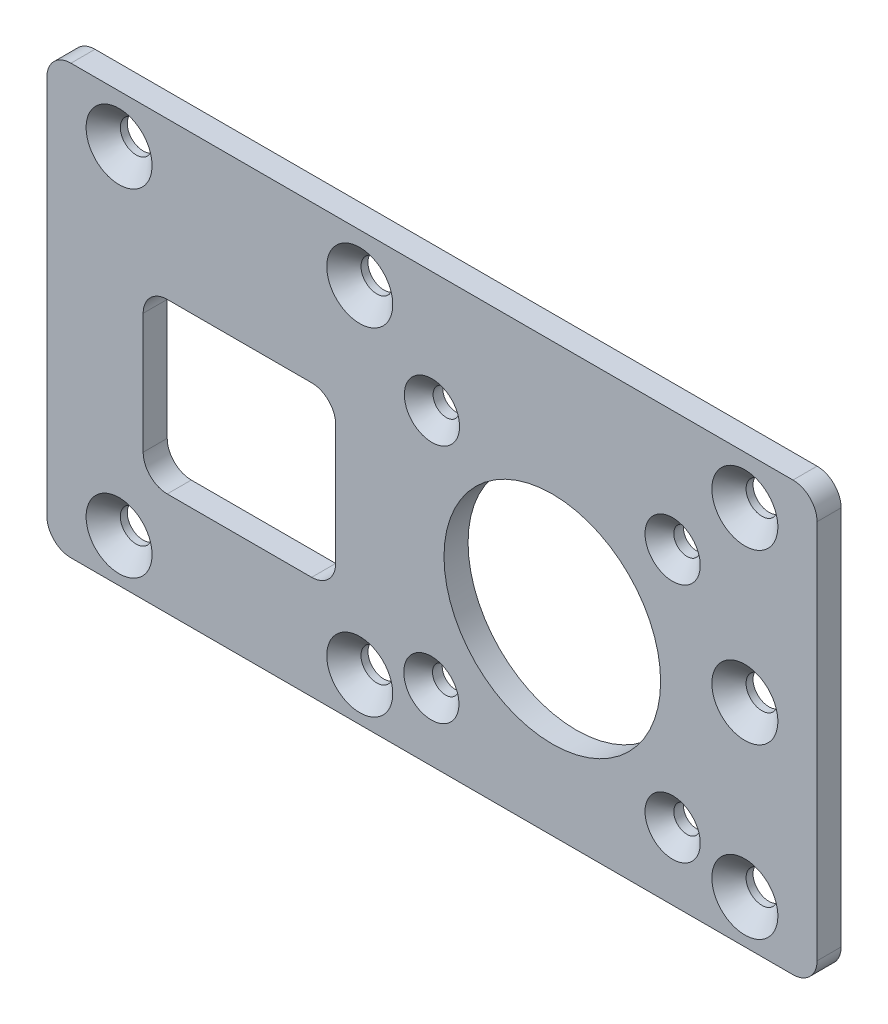
ISO-10303-21;
HEADER;
FILE_DESCRIPTION(('STEP AP214'),'2;1');
FILE_NAME('part.step','',(''),(''),'','','');
FILE_SCHEMA(('AUTOMOTIVE_DESIGN { 1 0 10303 214 1 1 1 1 }'));
ENDSEC;
DATA;
#1=APPLICATION_CONTEXT('core data for automotive mechanical design processes');
#2=APPLICATION_PROTOCOL_DEFINITION('international standard','automotive_design',2000,#1);
#3=PRODUCT_CONTEXT('',#1,'mechanical');
#4=PRODUCT('Part','Part','',(#3));
#5=PRODUCT_RELATED_PRODUCT_CATEGORY('part','',(#4));
#6=PRODUCT_DEFINITION_FORMATION('','',#4);
#7=PRODUCT_DEFINITION_CONTEXT('part definition',#1,'design');
#8=PRODUCT_DEFINITION('design','',#6,#7);
#9=PRODUCT_DEFINITION_SHAPE('','',#8);
#10=(LENGTH_UNIT() NAMED_UNIT(*) SI_UNIT(.MILLI.,.METRE.));
#11=(NAMED_UNIT(*) PLANE_ANGLE_UNIT() SI_UNIT($,.RADIAN.));
#12=(NAMED_UNIT(*) SI_UNIT($,.STERADIAN.) SOLID_ANGLE_UNIT());
#13=UNCERTAINTY_MEASURE_WITH_UNIT(LENGTH_MEASURE(1.E-05),#10,'distance_accuracy_value','');
#14=(GEOMETRIC_REPRESENTATION_CONTEXT(3) GLOBAL_UNCERTAINTY_ASSIGNED_CONTEXT((#13)) GLOBAL_UNIT_ASSIGNED_CONTEXT((#10,
#11,#12)) REPRESENTATION_CONTEXT('',''));
#15=CARTESIAN_POINT('',(0.,0.,0.));
#16=DIRECTION('',(0.,0.,1.));
#17=DIRECTION('',(1.,0.,0.));
#18=AXIS2_PLACEMENT_3D('',#15,#16,#17);
#19=CARTESIAN_POINT('',(55.,-39.,-5.));
#20=DIRECTION('',(-1.,0.,0.));
#21=DIRECTION('',(0.,-1.,0.));
#22=AXIS2_PLACEMENT_3D('',#19,#20,#21);
#23=PLANE('',#22);
#24=DIRECTION('',(0.,1.,0.));
#25=VECTOR('',#24,1.);
#26=CARTESIAN_POINT('',(55.,-39.,-5.));
#27=LINE('',#26,#25);
#28=CARTESIAN_POINT('',(55.,-34.,-5.));
#29=VERTEX_POINT('',#28);
#30=CARTESIAN_POINT('',(55.,45.,-5.));
#31=VERTEX_POINT('',#30);
#32=EDGE_CURVE('E392',#29,#31,#27,.T.);
#33=ORIENTED_EDGE('',*,*,#32,.T.);
#34=DIRECTION('',(0.,0.,1.));
#35=VECTOR('',#34,1.);
#36=CARTESIAN_POINT('',(55.,45.,-5.));
#37=LINE('',#36,#35);
#38=CARTESIAN_POINT('',(55.,45.,0.));
#39=VERTEX_POINT('',#38);
#40=EDGE_CURVE('E208',#39,#31,#37,.F.);
#41=ORIENTED_EDGE('',*,*,#40,.F.);
#42=DIRECTION('',(0.,1.,0.));
#43=VECTOR('',#42,1.);
#44=CARTESIAN_POINT('',(55.,-39.,0.));
#45=LINE('',#44,#43);
#46=CARTESIAN_POINT('',(55.,-34.,0.));
#47=VERTEX_POINT('',#46);
#48=EDGE_CURVE('E409',#47,#39,#45,.T.);
#49=ORIENTED_EDGE('',*,*,#48,.F.);
#50=DIRECTION('',(0.,0.,1.));
#51=VECTOR('',#50,1.);
#52=CARTESIAN_POINT('',(55.,-34.,-5.));
#53=LINE('',#52,#51);
#54=EDGE_CURVE('E199',#29,#47,#53,.T.);
#55=ORIENTED_EDGE('',*,*,#54,.F.);
#56=EDGE_LOOP('',(#33,#41,#49,#55));
#57=FACE_BOUND('',#56,.T.);
#58=ADVANCED_FACE('F53',(#57),#23,.F.);
#59=CARTESIAN_POINT('',(-105.,50.0000000000005,-5.));
#60=DIRECTION('',(0.,-1.,0.));
#61=DIRECTION('',(1.,0.,0.));
#62=AXIS2_PLACEMENT_3D('',#59,#60,#61);
#63=PLANE('',#62);
#64=DIRECTION('',(-1.,0.,0.));
#65=VECTOR('',#64,1.);
#66=CARTESIAN_POINT('',(-105.,50.0000000000005,0.));
#67=LINE('',#66,#65);
#68=CARTESIAN_POINT('',(50.,50.,0.));
#69=VERTEX_POINT('',#68);
#70=CARTESIAN_POINT('',(-100.,50.0000000000005,0.));
#71=VERTEX_POINT('',#70);
#72=EDGE_CURVE('E413',#69,#71,#67,.T.);
#73=ORIENTED_EDGE('',*,*,#72,.F.);
#74=DIRECTION('',(0.,0.,1.));
#75=VECTOR('',#74,1.);
#76=CARTESIAN_POINT('',(50.,50.,-5.));
#77=LINE('',#76,#75);
#78=CARTESIAN_POINT('',(50.,50.,-5.));
#79=VERTEX_POINT('',#78);
#80=EDGE_CURVE('E481',#79,#69,#77,.T.);
#81=ORIENTED_EDGE('',*,*,#80,.F.);
#82=DIRECTION('',(-1.,0.,0.));
#83=VECTOR('',#82,1.);
#84=CARTESIAN_POINT('',(-105.,50.0000000000005,-5.));
#85=LINE('',#84,#83);
#86=CARTESIAN_POINT('',(-100.,50.0000000000005,-5.));
#87=VERTEX_POINT('',#86);
#88=EDGE_CURVE('E396',#79,#87,#85,.T.);
#89=ORIENTED_EDGE('',*,*,#88,.T.);
#90=DIRECTION('',(0.,0.,1.));
#91=VECTOR('',#90,1.);
#92=CARTESIAN_POINT('',(-100.,50.0000000000005,-5.));
#93=LINE('',#92,#91);
#94=EDGE_CURVE('E483',#71,#87,#93,.F.);
#95=ORIENTED_EDGE('',*,*,#94,.F.);
#96=EDGE_LOOP('',(#73,#81,#89,#95));
#97=FACE_BOUND('',#96,.T.);
#98=ADVANCED_FACE('F497',(#97),#63,.F.);
#99=CARTESIAN_POINT('',(-105.,-39.,-5.));
#100=DIRECTION('',(1.,0.,0.));
#101=DIRECTION('',(0.,0.,1.));
#102=AXIS2_PLACEMENT_3D('',#99,#100,#101);
#103=PLANE('',#102);
#104=DIRECTION('',(0.,-1.,0.));
#105=VECTOR('',#104,1.);
#106=CARTESIAN_POINT('',(-105.,-39.,0.));
#107=LINE('',#106,#105);
#108=CARTESIAN_POINT('',(-105.,45.0000000000005,0.));
#109=VERTEX_POINT('',#108);
#110=CARTESIAN_POINT('',(-105.,-34.,0.));
#111=VERTEX_POINT('',#110);
#112=EDGE_CURVE('E417',#109,#111,#107,.T.);
#113=ORIENTED_EDGE('',*,*,#112,.F.);
#114=DIRECTION('',(0.,0.,1.));
#115=VECTOR('',#114,1.);
#116=CARTESIAN_POINT('',(-105.,45.0000000000005,-5.));
#117=LINE('',#116,#115);
#118=CARTESIAN_POINT('',(-105.,45.0000000000005,-5.));
#119=VERTEX_POINT('',#118);
#120=EDGE_CURVE('E463',#119,#109,#117,.T.);
#121=ORIENTED_EDGE('',*,*,#120,.F.);
#122=DIRECTION('',(0.,-1.,0.));
#123=VECTOR('',#122,1.);
#124=CARTESIAN_POINT('',(-105.,-39.,-5.));
#125=LINE('',#124,#123);
#126=CARTESIAN_POINT('',(-105.,-34.,-5.));
#127=VERTEX_POINT('',#126);
#128=EDGE_CURVE('E401',#119,#127,#125,.T.);
#129=ORIENTED_EDGE('',*,*,#128,.T.);
#130=DIRECTION('',(0.,0.,1.));
#131=VECTOR('',#130,1.);
#132=CARTESIAN_POINT('',(-105.,-34.,-5.));
#133=LINE('',#132,#131);
#134=EDGE_CURVE('E467',#111,#127,#133,.F.);
#135=ORIENTED_EDGE('',*,*,#134,.F.);
#136=EDGE_LOOP('',(#113,#121,#129,#135));
#137=FACE_BOUND('',#136,.T.);
#138=ADVANCED_FACE('F512',(#137),#103,.F.);
#139=CARTESIAN_POINT('',(-105.,-39.,-5.));
#140=DIRECTION('',(0.,1.,0.));
#141=DIRECTION('',(0.,0.,-1.));
#142=AXIS2_PLACEMENT_3D('',#139,#140,#141);
#143=PLANE('',#142);
#144=DIRECTION('',(1.,0.,0.));
#145=VECTOR('',#144,1.);
#146=CARTESIAN_POINT('',(-105.,-39.,-5.));
#147=LINE('',#146,#145);
#148=CARTESIAN_POINT('',(-100.,-39.,-5.));
#149=VERTEX_POINT('',#148);
#150=CARTESIAN_POINT('',(50.,-39.,-5.));
#151=VERTEX_POINT('',#150);
#152=EDGE_CURVE('E405',#149,#151,#147,.T.);
#153=ORIENTED_EDGE('',*,*,#152,.T.);
#154=DIRECTION('',(0.,0.,1.));
#155=VECTOR('',#154,1.);
#156=CARTESIAN_POINT('',(50.,-39.,-5.));
#157=LINE('',#156,#155);
#158=CARTESIAN_POINT('',(50.,-39.,0.));
#159=VERTEX_POINT('',#158);
#160=EDGE_CURVE('E444',#159,#151,#157,.F.);
#161=ORIENTED_EDGE('',*,*,#160,.F.);
#162=DIRECTION('',(1.,0.,0.));
#163=VECTOR('',#162,1.);
#164=CARTESIAN_POINT('',(-105.,-39.,0.));
#165=LINE('',#164,#163);
#166=CARTESIAN_POINT('',(-100.,-39.,0.));
#167=VERTEX_POINT('',#166);
#168=EDGE_CURVE('E397',#167,#159,#165,.T.);
#169=ORIENTED_EDGE('',*,*,#168,.F.);
#170=DIRECTION('',(0.,0.,1.));
#171=VECTOR('',#170,1.);
#172=CARTESIAN_POINT('',(-100.,-39.,-5.));
#173=LINE('',#172,#171);
#174=EDGE_CURVE('E448',#149,#167,#173,.T.);
#175=ORIENTED_EDGE('',*,*,#174,.F.);
#176=EDGE_LOOP('',(#153,#161,#169,#175));
#177=FACE_BOUND('',#176,.T.);
#178=ADVANCED_FACE('F505',(#177),#143,.F.);
#179=CARTESIAN_POINT('',(0.,0.,-5.));
#180=DIRECTION('',(0.,0.,1.));
#181=DIRECTION('',(-1.,0.,0.));
#182=AXIS2_PLACEMENT_3D('',#179,#180,#181);
#183=PLANE('',#182);
#184=DIRECTION('',(0.,1.,0.));
#185=VECTOR('',#184,1.);
#186=CARTESIAN_POINT('',(-85.,0.,-5.));
#187=LINE('',#186,#185);
#188=CARTESIAN_POINT('',(-85.,-12.5,-5.));
#189=VERTEX_POINT('',#188);
#190=CARTESIAN_POINT('',(-85.,12.5,-5.));
#191=VERTEX_POINT('',#190);
#192=EDGE_CURVE('E246',#189,#191,#187,.T.);
#193=ORIENTED_EDGE('',*,*,#192,.F.);
#194=CARTESIAN_POINT('',(-80.,-12.5,-5.));
#195=DIRECTION('',(0.,0.,-1.));
#196=DIRECTION('',(-1.,0.,0.));
#197=AXIS2_PLACEMENT_3D('',#194,#195,#196);
#198=CIRCLE('',#197,5.);
#199=CARTESIAN_POINT('',(-80.,-17.5,-5.));
#200=VERTEX_POINT('',#199);
#201=EDGE_CURVE('E175',#200,#189,#198,.T.);
#202=ORIENTED_EDGE('',*,*,#201,.F.);
#203=DIRECTION('',(-1.,0.,0.));
#204=VECTOR('',#203,1.);
#205=CARTESIAN_POINT('',(0.,-17.5,-5.));
#206=LINE('',#205,#204);
#207=CARTESIAN_POINT('',(-50.,-17.5,-5.));
#208=VERTEX_POINT('',#207);
#209=EDGE_CURVE('E240',#208,#200,#206,.T.);
#210=ORIENTED_EDGE('',*,*,#209,.F.);
#211=CARTESIAN_POINT('',(-50.,-12.5,-5.));
#212=DIRECTION('',(0.,0.,-1.));
#213=DIRECTION('',(-1.,0.,0.));
#214=AXIS2_PLACEMENT_3D('',#211,#212,#213);
#215=CIRCLE('',#214,5.);
#216=CARTESIAN_POINT('',(-45.,-12.5,-5.));
#217=VERTEX_POINT('',#216);
#218=EDGE_CURVE('E222',#217,#208,#215,.T.);
#219=ORIENTED_EDGE('',*,*,#218,.F.);
#220=DIRECTION('',(0.,-1.,0.));
#221=VECTOR('',#220,1.);
#222=CARTESIAN_POINT('',(-45.,0.,-5.));
#223=LINE('',#222,#221);
#224=CARTESIAN_POINT('',(-45.,12.5,-5.));
#225=VERTEX_POINT('',#224);
#226=EDGE_CURVE('E255',#225,#217,#223,.T.);
#227=ORIENTED_EDGE('',*,*,#226,.F.);
#228=CARTESIAN_POINT('',(-50.,12.5,-5.));
#229=DIRECTION('',(0.,0.,-1.));
#230=DIRECTION('',(-1.,0.,0.));
#231=AXIS2_PLACEMENT_3D('',#228,#229,#230);
#232=CIRCLE('',#231,5.);
#233=CARTESIAN_POINT('',(-50.,17.5,-5.));
#234=VERTEX_POINT('',#233);
#235=EDGE_CURVE('E11',#234,#225,#232,.T.);
#236=ORIENTED_EDGE('',*,*,#235,.F.);
#237=DIRECTION('',(1.,0.,0.));
#238=VECTOR('',#237,1.);
#239=CARTESIAN_POINT('',(0.,17.5,-5.));
#240=LINE('',#239,#238);
#241=CARTESIAN_POINT('',(-80.,17.5,-5.));
#242=VERTEX_POINT('',#241);
#243=EDGE_CURVE('E252',#242,#234,#240,.T.);
#244=ORIENTED_EDGE('',*,*,#243,.F.);
#245=CARTESIAN_POINT('',(-80.,12.5,-5.));
#246=DIRECTION('',(0.,0.,-1.));
#247=DIRECTION('',(-1.,0.,0.));
#248=AXIS2_PLACEMENT_3D('',#245,#246,#247);
#249=CIRCLE('',#248,5.);
#250=EDGE_CURVE('E214',#191,#242,#249,.T.);
#251=ORIENTED_EDGE('',*,*,#250,.F.);
#252=EDGE_LOOP('',(#193,#202,#210,#219,#227,#236,#244,#251));
#253=FACE_BOUND('',#252,.T.);
#254=CARTESIAN_POINT('',(25.,25.,-5.));
#255=DIRECTION('',(0.,0.,-1.));
#256=DIRECTION('',(-1.,0.,0.));
#257=AXIS2_PLACEMENT_3D('',#254,#255,#256);
#258=CIRCLE('',#257,2.75);
#259=CARTESIAN_POINT('',(22.25,25.,-5.));
#260=VERTEX_POINT('',#259);
#261=EDGE_CURVE('E267',#260,#260,#258,.T.);
#262=ORIENTED_EDGE('',*,*,#261,.F.);
#263=EDGE_LOOP('',(#262));
#264=FACE_BOUND('',#263,.T.);
#265=CARTESIAN_POINT('',(25.,-25.,-5.));
#266=DIRECTION('',(0.,0.,-1.));
#267=DIRECTION('',(-1.,0.,0.));
#268=AXIS2_PLACEMENT_3D('',#265,#266,#267);
#269=CIRCLE('',#268,2.75);
#270=CARTESIAN_POINT('',(22.25,-25.,-5.));
#271=VERTEX_POINT('',#270);
#272=EDGE_CURVE('E278',#271,#271,#269,.T.);
#273=ORIENTED_EDGE('',*,*,#272,.F.);
#274=EDGE_LOOP('',(#273));
#275=FACE_BOUND('',#274,.T.);
#276=CARTESIAN_POINT('',(-25.1249454463221,-25.,-5.));
#277=DIRECTION('',(0.,0.,-1.));
#278=DIRECTION('',(-1.,0.,0.));
#279=AXIS2_PLACEMENT_3D('',#276,#277,#278);
#280=CIRCLE('',#279,2.75);
#281=CARTESIAN_POINT('',(-27.8749454463221,-25.,-5.));
#282=VERTEX_POINT('',#281);
#283=EDGE_CURVE('E290',#282,#282,#280,.T.);
#284=ORIENTED_EDGE('',*,*,#283,.F.);
#285=EDGE_LOOP('',(#284));
#286=FACE_BOUND('',#285,.T.);
#287=CARTESIAN_POINT('',(-25.,25.,-5.));
#288=DIRECTION('',(0.,0.,-1.));
#289=DIRECTION('',(-1.,0.,0.));
#290=AXIS2_PLACEMENT_3D('',#287,#288,#289);
#291=CIRCLE('',#290,2.75);
#292=CARTESIAN_POINT('',(-27.75,25.,-5.));
#293=VERTEX_POINT('',#292);
#294=EDGE_CURVE('E302',#293,#293,#291,.T.);
#295=ORIENTED_EDGE('',*,*,#294,.F.);
#296=EDGE_LOOP('',(#295));
#297=FACE_BOUND('',#296,.T.);
#298=CARTESIAN_POINT('',(40.,-30.,-5.));
#299=DIRECTION('',(0.,0.,-1.));
#300=DIRECTION('',(-1.,0.,0.));
#301=AXIS2_PLACEMENT_3D('',#298,#299,#300);
#302=CIRCLE('',#301,3.3);
#303=CARTESIAN_POINT('',(36.7,-30.,-5.));
#304=VERTEX_POINT('',#303);
#305=EDGE_CURVE('E314',#304,#304,#302,.T.);
#306=ORIENTED_EDGE('',*,*,#305,.F.);
#307=EDGE_LOOP('',(#306));
#308=FACE_BOUND('',#307,.T.);
#309=CARTESIAN_POINT('',(40.,4.99999999999999,-5.));
#310=DIRECTION('',(0.,0.,-1.));
#311=DIRECTION('',(-1.,0.,0.));
#312=AXIS2_PLACEMENT_3D('',#309,#310,#311);
#313=CIRCLE('',#312,3.3);
#314=CARTESIAN_POINT('',(36.7,4.99999999999999,-5.));
#315=VERTEX_POINT('',#314);
#316=EDGE_CURVE('E325',#315,#315,#313,.T.);
#317=ORIENTED_EDGE('',*,*,#316,.F.);
#318=EDGE_LOOP('',(#317));
#319=FACE_BOUND('',#318,.T.);
#320=CARTESIAN_POINT('',(40.,40.,-5.));
#321=DIRECTION('',(0.,0.,-1.));
#322=DIRECTION('',(-1.,0.,0.));
#323=AXIS2_PLACEMENT_3D('',#320,#321,#322);
#324=CIRCLE('',#323,3.3);
#325=CARTESIAN_POINT('',(36.7,40.,-5.));
#326=VERTEX_POINT('',#325);
#327=EDGE_CURVE('E337',#326,#326,#324,.T.);
#328=ORIENTED_EDGE('',*,*,#327,.F.);
#329=EDGE_LOOP('',(#328));
#330=FACE_BOUND('',#329,.T.);
#331=CARTESIAN_POINT('',(-40.,40.,-5.));
#332=DIRECTION('',(0.,0.,-1.));
#333=DIRECTION('',(-1.,0.,0.));
#334=AXIS2_PLACEMENT_3D('',#331,#332,#333);
#335=CIRCLE('',#334,3.3);
#336=CARTESIAN_POINT('',(-43.3,40.,-5.));
#337=VERTEX_POINT('',#336);
#338=EDGE_CURVE('E349',#337,#337,#335,.T.);
#339=ORIENTED_EDGE('',*,*,#338,.F.);
#340=EDGE_LOOP('',(#339));
#341=FACE_BOUND('',#340,.T.);
#342=CARTESIAN_POINT('',(-40.,-30.,-5.));
#343=DIRECTION('',(0.,0.,-1.));
#344=DIRECTION('',(-1.,0.,0.));
#345=AXIS2_PLACEMENT_3D('',#342,#343,#344);
#346=CIRCLE('',#345,3.3);
#347=CARTESIAN_POINT('',(-43.3,-30.,-5.));
#348=VERTEX_POINT('',#347);
#349=EDGE_CURVE('E361',#348,#348,#346,.T.);
#350=ORIENTED_EDGE('',*,*,#349,.F.);
#351=EDGE_LOOP('',(#350));
#352=FACE_BOUND('',#351,.T.);
#353=CARTESIAN_POINT('',(-90.,-30.,-5.));
#354=DIRECTION('',(0.,0.,-1.));
#355=DIRECTION('',(-1.,0.,0.));
#356=AXIS2_PLACEMENT_3D('',#353,#354,#355);
#357=CIRCLE('',#356,3.3);
#358=CARTESIAN_POINT('',(-93.3,-30.,-5.));
#359=VERTEX_POINT('',#358);
#360=EDGE_CURVE('E373',#359,#359,#357,.T.);
#361=ORIENTED_EDGE('',*,*,#360,.F.);
#362=EDGE_LOOP('',(#361));
#363=FACE_BOUND('',#362,.T.);
#364=CARTESIAN_POINT('',(-90.,40.,-5.));
#365=DIRECTION('',(0.,0.,-1.));
#366=DIRECTION('',(-1.,0.,0.));
#367=AXIS2_PLACEMENT_3D('',#364,#365,#366);
#368=CIRCLE('',#367,3.3);
#369=CARTESIAN_POINT('',(-93.3,40.,-5.));
#370=VERTEX_POINT('',#369);
#371=EDGE_CURVE('E383',#370,#370,#368,.T.);
#372=ORIENTED_EDGE('',*,*,#371,.F.);
#373=EDGE_LOOP('',(#372));
#374=FACE_BOUND('',#373,.T.);
#375=CARTESIAN_POINT('',(0.,0.,-5.));
#376=DIRECTION('',(0.,0.,1.));
#377=DIRECTION('',(1.,0.,0.));
#378=AXIS2_PLACEMENT_3D('',#375,#376,#377);
#379=CIRCLE('',#378,22.5);
#380=CARTESIAN_POINT('',(22.5,0.,-5.));
#381=VERTEX_POINT('',#380);
#382=EDGE_CURVE('E387',#381,#381,#379,.T.);
#383=ORIENTED_EDGE('',*,*,#382,.T.);
#384=EDGE_LOOP('',(#383));
#385=FACE_BOUND('',#384,.T.);
#386=ORIENTED_EDGE('',*,*,#128,.F.);
#387=CARTESIAN_POINT('',(-100.,45.0000000000005,-5.));
#388=DIRECTION('',(0.,0.,-1.));
#389=DIRECTION('',(-1.,0.,0.));
#390=AXIS2_PLACEMENT_3D('',#387,#388,#389);
#391=CIRCLE('',#390,5.);
#392=EDGE_CURVE('E69',#87,#119,#391,.F.);
#393=ORIENTED_EDGE('',*,*,#392,.F.);
#394=ORIENTED_EDGE('',*,*,#88,.F.);
#395=CARTESIAN_POINT('',(50.,45.,-5.));
#396=DIRECTION('',(0.,0.,-1.));
#397=DIRECTION('',(-1.,0.,0.));
#398=AXIS2_PLACEMENT_3D('',#395,#396,#397);
#399=CIRCLE('',#398,5.);
#400=EDGE_CURVE('E77',#31,#79,#399,.F.);
#401=ORIENTED_EDGE('',*,*,#400,.F.);
#402=ORIENTED_EDGE('',*,*,#32,.F.);
#403=CARTESIAN_POINT('',(50.,-34.,-5.));
#404=DIRECTION('',(0.,0.,-1.));
#405=DIRECTION('',(-1.,0.,0.));
#406=AXIS2_PLACEMENT_3D('',#403,#404,#405);
#407=CIRCLE('',#406,5.);
#408=EDGE_CURVE('E473',#151,#29,#407,.F.);
#409=ORIENTED_EDGE('',*,*,#408,.F.);
#410=ORIENTED_EDGE('',*,*,#152,.F.);
#411=CARTESIAN_POINT('',(-100.,-34.,-5.));
#412=DIRECTION('',(0.,0.,-1.));
#413=DIRECTION('',(-1.,0.,0.));
#414=AXIS2_PLACEMENT_3D('',#411,#412,#413);
#415=CIRCLE('',#414,5.);
#416=EDGE_CURVE('E478',#127,#149,#415,.F.);
#417=ORIENTED_EDGE('',*,*,#416,.F.);
#418=EDGE_LOOP('',(#386,#393,#394,#401,#402,#409,#410,#417));
#419=FACE_BOUND('',#418,.T.);
#420=ADVANCED_FACE('F491',(#253,#264,#275,#286,#297,#308,#319,#330,#341,#352,#363,#374,#385,
#419),#183,.F.);
#421=CARTESIAN_POINT('',(0.,0.,0.));
#422=DIRECTION('',(0.,0.,1.));
#423=DIRECTION('',(-1.,0.,0.));
#424=AXIS2_PLACEMENT_3D('',#421,#422,#423);
#425=PLANE('',#424);
#426=DIRECTION('',(0.,-1.,0.));
#427=VECTOR('',#426,1.);
#428=CARTESIAN_POINT('',(-45.,-17.5,0.));
#429=LINE('',#428,#427);
#430=CARTESIAN_POINT('',(-45.,12.5,0.));
#431=VERTEX_POINT('',#430);
#432=CARTESIAN_POINT('',(-45.,-12.5,0.));
#433=VERTEX_POINT('',#432);
#434=EDGE_CURVE('E1107',#431,#433,#429,.T.);
#435=ORIENTED_EDGE('',*,*,#434,.T.);
#436=CARTESIAN_POINT('',(-50.,-12.5,0.));
#437=DIRECTION('',(0.,0.,-1.));
#438=DIRECTION('',(-1.,0.,0.));
#439=AXIS2_PLACEMENT_3D('',#436,#437,#438);
#440=CIRCLE('',#439,5.);
#441=CARTESIAN_POINT('',(-50.,-17.5,0.));
#442=VERTEX_POINT('',#441);
#443=EDGE_CURVE('E218',#442,#433,#440,.F.);
#444=ORIENTED_EDGE('',*,*,#443,.F.);
#445=DIRECTION('',(-1.,0.,0.));
#446=VECTOR('',#445,1.);
#447=CARTESIAN_POINT('',(-85.,-17.5,0.));
#448=LINE('',#447,#446);
#449=CARTESIAN_POINT('',(-80.,-17.5,0.));
#450=VERTEX_POINT('',#449);
#451=EDGE_CURVE('E191',#442,#450,#448,.T.);
#452=ORIENTED_EDGE('',*,*,#451,.T.);
#453=CARTESIAN_POINT('',(-80.,-12.5,0.));
#454=DIRECTION('',(0.,0.,-1.));
#455=DIRECTION('',(-1.,0.,0.));
#456=AXIS2_PLACEMENT_3D('',#453,#454,#455);
#457=CIRCLE('',#456,5.);
#458=CARTESIAN_POINT('',(-85.,-12.5,0.));
#459=VERTEX_POINT('',#458);
#460=EDGE_CURVE('E172',#459,#450,#457,.F.);
#461=ORIENTED_EDGE('',*,*,#460,.F.);
#462=DIRECTION('',(0.,1.,0.));
#463=VECTOR('',#462,1.);
#464=CARTESIAN_POINT('',(-85.,-17.5,0.));
#465=LINE('',#464,#463);
#466=CARTESIAN_POINT('',(-85.,12.5,0.));
#467=VERTEX_POINT('',#466);
#468=EDGE_CURVE('E184',#459,#467,#465,.T.);
#469=ORIENTED_EDGE('',*,*,#468,.T.);
#470=CARTESIAN_POINT('',(-80.,12.5,0.));
#471=DIRECTION('',(0.,0.,-1.));
#472=DIRECTION('',(-1.,0.,0.));
#473=AXIS2_PLACEMENT_3D('',#470,#471,#472);
#474=CIRCLE('',#473,5.);
#475=CARTESIAN_POINT('',(-80.,17.5,0.));
#476=VERTEX_POINT('',#475);
#477=EDGE_CURVE('E204',#476,#467,#474,.F.);
#478=ORIENTED_EDGE('',*,*,#477,.F.);
#479=DIRECTION('',(1.,0.,0.));
#480=VECTOR('',#479,1.);
#481=CARTESIAN_POINT('',(-85.,17.5,0.));
#482=LINE('',#481,#480);
#483=CARTESIAN_POINT('',(-50.,17.5,0.));
#484=VERTEX_POINT('',#483);
#485=EDGE_CURVE('E190',#476,#484,#482,.T.);
#486=ORIENTED_EDGE('',*,*,#485,.T.);
#487=CARTESIAN_POINT('',(-50.,12.5,0.));
#488=DIRECTION('',(0.,0.,-1.));
#489=DIRECTION('',(-1.,0.,0.));
#490=AXIS2_PLACEMENT_3D('',#487,#488,#489);
#491=CIRCLE('',#490,5.);
#492=EDGE_CURVE('E62',#431,#484,#491,.F.);
#493=ORIENTED_EDGE('',*,*,#492,.F.);
#494=EDGE_LOOP('',(#435,#444,#452,#461,#469,#478,#486,#493));
#495=FACE_BOUND('',#494,.T.);
#496=CARTESIAN_POINT('',(25.,25.,0.));
#497=DIRECTION('',(0.,0.,-1.));
#498=DIRECTION('',(-1.,0.,0.));
#499=AXIS2_PLACEMENT_3D('',#496,#497,#498);
#500=CIRCLE('',#499,5.735);
#501=CARTESIAN_POINT('',(19.265,25.,0.));
#502=VERTEX_POINT('',#501);
#503=EDGE_CURVE('E259',#502,#502,#500,.T.);
#504=ORIENTED_EDGE('',*,*,#503,.T.);
#505=EDGE_LOOP('',(#504));
#506=FACE_BOUND('',#505,.T.);
#507=CARTESIAN_POINT('',(25.,-25.,0.));
#508=DIRECTION('',(0.,0.,-1.));
#509=DIRECTION('',(-1.,0.,0.));
#510=AXIS2_PLACEMENT_3D('',#507,#508,#509);
#511=CIRCLE('',#510,5.735);
#512=CARTESIAN_POINT('',(19.265,-25.,0.));
#513=VERTEX_POINT('',#512);
#514=EDGE_CURVE('E271',#513,#513,#511,.T.);
#515=ORIENTED_EDGE('',*,*,#514,.T.);
#516=EDGE_LOOP('',(#515));
#517=FACE_BOUND('',#516,.T.);
#518=CARTESIAN_POINT('',(-25.1249454463221,-25.,0.));
#519=DIRECTION('',(0.,0.,-1.));
#520=DIRECTION('',(-1.,0.,0.));
#521=AXIS2_PLACEMENT_3D('',#518,#519,#520);
#522=CIRCLE('',#521,5.735);
#523=CARTESIAN_POINT('',(-30.8599454463221,-25.,0.));
#524=VERTEX_POINT('',#523);
#525=EDGE_CURVE('E282',#524,#524,#522,.T.);
#526=ORIENTED_EDGE('',*,*,#525,.T.);
#527=EDGE_LOOP('',(#526));
#528=FACE_BOUND('',#527,.T.);
#529=CARTESIAN_POINT('',(-25.,25.,0.));
#530=DIRECTION('',(0.,0.,-1.));
#531=DIRECTION('',(-1.,0.,0.));
#532=AXIS2_PLACEMENT_3D('',#529,#530,#531);
#533=CIRCLE('',#532,5.735);
#534=CARTESIAN_POINT('',(-30.735,25.,0.));
#535=VERTEX_POINT('',#534);
#536=EDGE_CURVE('E294',#535,#535,#533,.T.);
#537=ORIENTED_EDGE('',*,*,#536,.T.);
#538=EDGE_LOOP('',(#537));
#539=FACE_BOUND('',#538,.T.);
#540=CARTESIAN_POINT('',(40.,-30.,0.));
#541=DIRECTION('',(0.,0.,-1.));
#542=DIRECTION('',(-1.,0.,0.));
#543=AXIS2_PLACEMENT_3D('',#540,#541,#542);
#544=CIRCLE('',#543,6.855);
#545=CARTESIAN_POINT('',(33.145,-30.,0.));
#546=VERTEX_POINT('',#545);
#547=EDGE_CURVE('E306',#546,#546,#544,.T.);
#548=ORIENTED_EDGE('',*,*,#547,.T.);
#549=EDGE_LOOP('',(#548));
#550=FACE_BOUND('',#549,.T.);
#551=CARTESIAN_POINT('',(40.,4.99999999999999,0.));
#552=DIRECTION('',(0.,0.,-1.));
#553=DIRECTION('',(-1.,0.,0.));
#554=AXIS2_PLACEMENT_3D('',#551,#552,#553);
#555=CIRCLE('',#554,6.855);
#556=CARTESIAN_POINT('',(33.145,4.99999999999999,0.));
#557=VERTEX_POINT('',#556);
#558=EDGE_CURVE('E317',#557,#557,#555,.T.);
#559=ORIENTED_EDGE('',*,*,#558,.T.);
#560=EDGE_LOOP('',(#559));
#561=FACE_BOUND('',#560,.T.);
#562=CARTESIAN_POINT('',(40.,40.,0.));
#563=DIRECTION('',(0.,0.,-1.));
#564=DIRECTION('',(-1.,0.,0.));
#565=AXIS2_PLACEMENT_3D('',#562,#563,#564);
#566=CIRCLE('',#565,6.855);
#567=CARTESIAN_POINT('',(33.145,40.,0.));
#568=VERTEX_POINT('',#567);
#569=EDGE_CURVE('E329',#568,#568,#566,.T.);
#570=ORIENTED_EDGE('',*,*,#569,.T.);
#571=EDGE_LOOP('',(#570));
#572=FACE_BOUND('',#571,.T.);
#573=CARTESIAN_POINT('',(-40.,40.,0.));
#574=DIRECTION('',(0.,0.,-1.));
#575=DIRECTION('',(-1.,0.,0.));
#576=AXIS2_PLACEMENT_3D('',#573,#574,#575);
#577=CIRCLE('',#576,6.855);
#578=CARTESIAN_POINT('',(-46.855,40.,0.));
#579=VERTEX_POINT('',#578);
#580=EDGE_CURVE('E341',#579,#579,#577,.T.);
#581=ORIENTED_EDGE('',*,*,#580,.T.);
#582=EDGE_LOOP('',(#581));
#583=FACE_BOUND('',#582,.T.);
#584=CARTESIAN_POINT('',(-40.,-30.,0.));
#585=DIRECTION('',(0.,0.,-1.));
#586=DIRECTION('',(-1.,0.,0.));
#587=AXIS2_PLACEMENT_3D('',#584,#585,#586);
#588=CIRCLE('',#587,6.855);
#589=CARTESIAN_POINT('',(-46.855,-30.,0.));
#590=VERTEX_POINT('',#589);
#591=EDGE_CURVE('E353',#590,#590,#588,.T.);
#592=ORIENTED_EDGE('',*,*,#591,.T.);
#593=EDGE_LOOP('',(#592));
#594=FACE_BOUND('',#593,.T.);
#595=CARTESIAN_POINT('',(-90.,-30.,0.));
#596=DIRECTION('',(0.,0.,-1.));
#597=DIRECTION('',(-1.,0.,0.));
#598=AXIS2_PLACEMENT_3D('',#595,#596,#597);
#599=CIRCLE('',#598,6.855);
#600=CARTESIAN_POINT('',(-96.855,-30.,0.));
#601=VERTEX_POINT('',#600);
#602=EDGE_CURVE('E365',#601,#601,#599,.T.);
#603=ORIENTED_EDGE('',*,*,#602,.T.);
#604=EDGE_LOOP('',(#603));
#605=FACE_BOUND('',#604,.T.);
#606=CARTESIAN_POINT('',(-90.,40.,0.));
#607=DIRECTION('',(0.,0.,-1.));
#608=DIRECTION('',(-1.,0.,0.));
#609=AXIS2_PLACEMENT_3D('',#606,#607,#608);
#610=CIRCLE('',#609,6.855);
#611=CARTESIAN_POINT('',(-96.855,40.,0.));
#612=VERTEX_POINT('',#611);
#613=EDGE_CURVE('E376',#612,#612,#610,.T.);
#614=ORIENTED_EDGE('',*,*,#613,.T.);
#615=EDGE_LOOP('',(#614));
#616=FACE_BOUND('',#615,.T.);
#617=CARTESIAN_POINT('',(0.,0.,0.));
#618=DIRECTION('',(0.,0.,-1.));
#619=DIRECTION('',(-1.,0.,0.));
#620=AXIS2_PLACEMENT_3D('',#617,#618,#619);
#621=CIRCLE('',#620,22.5);
#622=CARTESIAN_POINT('',(-22.5,0.,0.));
#623=VERTEX_POINT('',#622);
#624=EDGE_CURVE('E391',#623,#623,#621,.T.);
#625=ORIENTED_EDGE('',*,*,#624,.T.);
#626=EDGE_LOOP('',(#625));
#627=FACE_BOUND('',#626,.T.);
#628=ORIENTED_EDGE('',*,*,#168,.T.);
#629=CARTESIAN_POINT('',(50.,-34.,0.));
#630=DIRECTION('',(0.,0.,-1.));
#631=DIRECTION('',(-1.,0.,0.));
#632=AXIS2_PLACEMENT_3D('',#629,#630,#631);
#633=CIRCLE('',#632,5.);
#634=EDGE_CURVE('E455',#47,#159,#633,.T.);
#635=ORIENTED_EDGE('',*,*,#634,.F.);
#636=ORIENTED_EDGE('',*,*,#48,.T.);
#637=CARTESIAN_POINT('',(50.,45.,0.));
#638=DIRECTION('',(0.,0.,-1.));
#639=DIRECTION('',(-1.,0.,0.));
#640=AXIS2_PLACEMENT_3D('',#637,#638,#639);
#641=CIRCLE('',#640,5.);
#642=EDGE_CURVE('E452',#69,#39,#641,.T.);
#643=ORIENTED_EDGE('',*,*,#642,.F.);
#644=ORIENTED_EDGE('',*,*,#72,.T.);
#645=CARTESIAN_POINT('',(-100.,45.0000000000005,0.));
#646=DIRECTION('',(0.,0.,-1.));
#647=DIRECTION('',(-1.,0.,0.));
#648=AXIS2_PLACEMENT_3D('',#645,#646,#647);
#649=CIRCLE('',#648,5.);
#650=EDGE_CURVE('E458',#109,#71,#649,.T.);
#651=ORIENTED_EDGE('',*,*,#650,.F.);
#652=ORIENTED_EDGE('',*,*,#112,.T.);
#653=CARTESIAN_POINT('',(-100.,-34.,0.));
#654=DIRECTION('',(0.,0.,-1.));
#655=DIRECTION('',(-1.,0.,0.));
#656=AXIS2_PLACEMENT_3D('',#653,#654,#655);
#657=CIRCLE('',#656,5.);
#658=EDGE_CURVE('E460',#167,#111,#657,.T.);
#659=ORIENTED_EDGE('',*,*,#658,.F.);
#660=EDGE_LOOP('',(#628,#635,#636,#643,#644,#651,#652,#659));
#661=FACE_BOUND('',#660,.T.);
#662=ADVANCED_FACE('F194',(#495,#506,#517,#528,#539,#550,#561,#572,#583,#594,#605,#616,#627,
#661),#425,.T.);
#663=CARTESIAN_POINT('',(0.,0.,5.));
#664=DIRECTION('',(0.,0.,-1.));
#665=DIRECTION('',(1.,0.,0.));
#666=AXIS2_PLACEMENT_3D('',#663,#664,#665);
#667=CYLINDRICAL_SURFACE('',#666,22.5);
#668=ORIENTED_EDGE('',*,*,#624,.F.);
#669=EDGE_LOOP('',(#668));
#670=FACE_BOUND('',#669,.T.);
#671=ORIENTED_EDGE('',*,*,#382,.F.);
#672=EDGE_LOOP('',(#671));
#673=FACE_BOUND('',#672,.T.);
#674=ADVANCED_FACE('F918',(#670,#673),#667,.F.);
#675=CARTESIAN_POINT('',(-90.,40.,0.));
#676=DIRECTION('',(0.,0.,1.));
#677=DIRECTION('',(-1.,0.,0.));
#678=AXIS2_PLACEMENT_3D('',#675,#676,#677);
#679=CYLINDRICAL_SURFACE('',#678,3.3);
#680=ORIENTED_EDGE('',*,*,#371,.T.);
#681=EDGE_LOOP('',(#680));
#682=FACE_BOUND('',#681,.T.);
#683=CARTESIAN_POINT('',(-90.,40.,-3.555));
#684=DIRECTION('',(0.,0.,-1.));
#685=DIRECTION('',(-1.,0.,0.));
#686=AXIS2_PLACEMENT_3D('',#683,#684,#685);
#687=CIRCLE('',#686,3.3);
#688=CARTESIAN_POINT('',(-93.3,40.,-3.555));
#689=VERTEX_POINT('',#688);
#690=EDGE_CURVE('E380',#689,#689,#687,.T.);
#691=ORIENTED_EDGE('',*,*,#690,.F.);
#692=EDGE_LOOP('',(#691));
#693=FACE_BOUND('',#692,.T.);
#694=ADVANCED_FACE('F906',(#682,#693),#679,.F.);
#695=CARTESIAN_POINT('',(-90.,40.,0.));
#696=DIRECTION('',(0.,0.,1.));
#697=DIRECTION('',(-1.,0.,0.));
#698=AXIS2_PLACEMENT_3D('',#695,#696,#697);
#699=CONICAL_SURFACE('',#698,6.855,0.785398163397448);
#700=ORIENTED_EDGE('',*,*,#690,.T.);
#701=EDGE_LOOP('',(#700));
#702=FACE_BOUND('',#701,.T.);
#703=ORIENTED_EDGE('',*,*,#613,.F.);
#704=EDGE_LOOP('',(#703));
#705=FACE_BOUND('',#704,.T.);
#706=ADVANCED_FACE('F894',(#702,#705),#699,.F.);
#707=CARTESIAN_POINT('',(-90.,-30.,0.));
#708=DIRECTION('',(0.,0.,1.));
#709=DIRECTION('',(-1.,0.,0.));
#710=AXIS2_PLACEMENT_3D('',#707,#708,#709);
#711=CYLINDRICAL_SURFACE('',#710,3.3);
#712=ORIENTED_EDGE('',*,*,#360,.T.);
#713=EDGE_LOOP('',(#712));
#714=FACE_BOUND('',#713,.T.);
#715=CARTESIAN_POINT('',(-90.,-30.,-3.555));
#716=DIRECTION('',(0.,0.,-1.));
#717=DIRECTION('',(-1.,0.,0.));
#718=AXIS2_PLACEMENT_3D('',#715,#716,#717);
#719=CIRCLE('',#718,3.3);
#720=CARTESIAN_POINT('',(-93.3,-30.,-3.555));
#721=VERTEX_POINT('',#720);
#722=EDGE_CURVE('E369',#721,#721,#719,.T.);
#723=ORIENTED_EDGE('',*,*,#722,.F.);
#724=EDGE_LOOP('',(#723));
#725=FACE_BOUND('',#724,.T.);
#726=ADVANCED_FACE('F882',(#714,#725),#711,.F.);
#727=CARTESIAN_POINT('',(-90.,-30.,0.));
#728=DIRECTION('',(0.,0.,1.));
#729=DIRECTION('',(-1.,0.,0.));
#730=AXIS2_PLACEMENT_3D('',#727,#728,#729);
#731=CONICAL_SURFACE('',#730,6.855,0.785398163397448);
#732=ORIENTED_EDGE('',*,*,#722,.T.);
#733=EDGE_LOOP('',(#732));
#734=FACE_BOUND('',#733,.T.);
#735=ORIENTED_EDGE('',*,*,#602,.F.);
#736=EDGE_LOOP('',(#735));
#737=FACE_BOUND('',#736,.T.);
#738=ADVANCED_FACE('F870',(#734,#737),#731,.F.);
#739=CARTESIAN_POINT('',(-40.,-30.,0.));
#740=DIRECTION('',(0.,0.,1.));
#741=DIRECTION('',(-1.,0.,0.));
#742=AXIS2_PLACEMENT_3D('',#739,#740,#741);
#743=CYLINDRICAL_SURFACE('',#742,3.3);
#744=ORIENTED_EDGE('',*,*,#349,.T.);
#745=EDGE_LOOP('',(#744));
#746=FACE_BOUND('',#745,.T.);
#747=CARTESIAN_POINT('',(-40.,-30.,-3.555));
#748=DIRECTION('',(0.,0.,-1.));
#749=DIRECTION('',(-1.,0.,0.));
#750=AXIS2_PLACEMENT_3D('',#747,#748,#749);
#751=CIRCLE('',#750,3.3);
#752=CARTESIAN_POINT('',(-43.3,-30.,-3.555));
#753=VERTEX_POINT('',#752);
#754=EDGE_CURVE('E357',#753,#753,#751,.T.);
#755=ORIENTED_EDGE('',*,*,#754,.F.);
#756=EDGE_LOOP('',(#755));
#757=FACE_BOUND('',#756,.T.);
#758=ADVANCED_FACE('F858',(#746,#757),#743,.F.);
#759=CARTESIAN_POINT('',(-40.,-30.,0.));
#760=DIRECTION('',(0.,0.,1.));
#761=DIRECTION('',(-1.,0.,0.));
#762=AXIS2_PLACEMENT_3D('',#759,#760,#761);
#763=CONICAL_SURFACE('',#762,6.855,0.785398163397448);
#764=ORIENTED_EDGE('',*,*,#754,.T.);
#765=EDGE_LOOP('',(#764));
#766=FACE_BOUND('',#765,.T.);
#767=ORIENTED_EDGE('',*,*,#591,.F.);
#768=EDGE_LOOP('',(#767));
#769=FACE_BOUND('',#768,.T.);
#770=ADVANCED_FACE('F846',(#766,#769),#763,.F.);
#771=CARTESIAN_POINT('',(-40.,40.,0.));
#772=DIRECTION('',(0.,0.,1.));
#773=DIRECTION('',(-1.,0.,0.));
#774=AXIS2_PLACEMENT_3D('',#771,#772,#773);
#775=CYLINDRICAL_SURFACE('',#774,3.3);
#776=ORIENTED_EDGE('',*,*,#338,.T.);
#777=EDGE_LOOP('',(#776));
#778=FACE_BOUND('',#777,.T.);
#779=CARTESIAN_POINT('',(-40.,40.,-3.555));
#780=DIRECTION('',(0.,0.,-1.));
#781=DIRECTION('',(-1.,0.,0.));
#782=AXIS2_PLACEMENT_3D('',#779,#780,#781);
#783=CIRCLE('',#782,3.3);
#784=CARTESIAN_POINT('',(-43.3,40.,-3.555));
#785=VERTEX_POINT('',#784);
#786=EDGE_CURVE('E345',#785,#785,#783,.T.);
#787=ORIENTED_EDGE('',*,*,#786,.F.);
#788=EDGE_LOOP('',(#787));
#789=FACE_BOUND('',#788,.T.);
#790=ADVANCED_FACE('F834',(#778,#789),#775,.F.);
#791=CARTESIAN_POINT('',(-40.,40.,0.));
#792=DIRECTION('',(0.,0.,1.));
#793=DIRECTION('',(-1.,0.,0.));
#794=AXIS2_PLACEMENT_3D('',#791,#792,#793);
#795=CONICAL_SURFACE('',#794,6.855,0.785398163397448);
#796=ORIENTED_EDGE('',*,*,#786,.T.);
#797=EDGE_LOOP('',(#796));
#798=FACE_BOUND('',#797,.T.);
#799=ORIENTED_EDGE('',*,*,#580,.F.);
#800=EDGE_LOOP('',(#799));
#801=FACE_BOUND('',#800,.T.);
#802=ADVANCED_FACE('F822',(#798,#801),#795,.F.);
#803=CARTESIAN_POINT('',(40.,40.,0.));
#804=DIRECTION('',(0.,0.,1.));
#805=DIRECTION('',(-1.,0.,0.));
#806=AXIS2_PLACEMENT_3D('',#803,#804,#805);
#807=CYLINDRICAL_SURFACE('',#806,3.3);
#808=ORIENTED_EDGE('',*,*,#327,.T.);
#809=EDGE_LOOP('',(#808));
#810=FACE_BOUND('',#809,.T.);
#811=CARTESIAN_POINT('',(40.,40.,-3.555));
#812=DIRECTION('',(0.,0.,-1.));
#813=DIRECTION('',(-1.,0.,0.));
#814=AXIS2_PLACEMENT_3D('',#811,#812,#813);
#815=CIRCLE('',#814,3.3);
#816=CARTESIAN_POINT('',(36.7,40.,-3.555));
#817=VERTEX_POINT('',#816);
#818=EDGE_CURVE('E333',#817,#817,#815,.T.);
#819=ORIENTED_EDGE('',*,*,#818,.F.);
#820=EDGE_LOOP('',(#819));
#821=FACE_BOUND('',#820,.T.);
#822=ADVANCED_FACE('F810',(#810,#821),#807,.F.);
#823=CARTESIAN_POINT('',(40.,40.,0.));
#824=DIRECTION('',(0.,0.,1.));
#825=DIRECTION('',(-1.,0.,0.));
#826=AXIS2_PLACEMENT_3D('',#823,#824,#825);
#827=CONICAL_SURFACE('',#826,6.855,0.785398163397448);
#828=ORIENTED_EDGE('',*,*,#818,.T.);
#829=EDGE_LOOP('',(#828));
#830=FACE_BOUND('',#829,.T.);
#831=ORIENTED_EDGE('',*,*,#569,.F.);
#832=EDGE_LOOP('',(#831));
#833=FACE_BOUND('',#832,.T.);
#834=ADVANCED_FACE('F798',(#830,#833),#827,.F.);
#835=CARTESIAN_POINT('',(40.,4.99999999999999,0.));
#836=DIRECTION('',(0.,0.,1.));
#837=DIRECTION('',(-1.,0.,0.));
#838=AXIS2_PLACEMENT_3D('',#835,#836,#837);
#839=CYLINDRICAL_SURFACE('',#838,3.3);
#840=ORIENTED_EDGE('',*,*,#316,.T.);
#841=EDGE_LOOP('',(#840));
#842=FACE_BOUND('',#841,.T.);
#843=CARTESIAN_POINT('',(40.,4.99999999999999,-3.555));
#844=DIRECTION('',(0.,0.,-1.));
#845=DIRECTION('',(-1.,0.,0.));
#846=AXIS2_PLACEMENT_3D('',#843,#844,#845);
#847=CIRCLE('',#846,3.3);
#848=CARTESIAN_POINT('',(36.7,4.99999999999999,-3.555));
#849=VERTEX_POINT('',#848);
#850=EDGE_CURVE('E321',#849,#849,#847,.T.);
#851=ORIENTED_EDGE('',*,*,#850,.F.);
#852=EDGE_LOOP('',(#851));
#853=FACE_BOUND('',#852,.T.);
#854=ADVANCED_FACE('F786',(#842,#853),#839,.F.);
#855=CARTESIAN_POINT('',(40.,4.99999999999999,0.));
#856=DIRECTION('',(0.,0.,1.));
#857=DIRECTION('',(-1.,0.,0.));
#858=AXIS2_PLACEMENT_3D('',#855,#856,#857);
#859=CONICAL_SURFACE('',#858,6.855,0.785398163397448);
#860=ORIENTED_EDGE('',*,*,#850,.T.);
#861=EDGE_LOOP('',(#860));
#862=FACE_BOUND('',#861,.T.);
#863=ORIENTED_EDGE('',*,*,#558,.F.);
#864=EDGE_LOOP('',(#863));
#865=FACE_BOUND('',#864,.T.);
#866=ADVANCED_FACE('F774',(#862,#865),#859,.F.);
#867=CARTESIAN_POINT('',(40.,-30.,0.));
#868=DIRECTION('',(0.,0.,1.));
#869=DIRECTION('',(-1.,0.,0.));
#870=AXIS2_PLACEMENT_3D('',#867,#868,#869);
#871=CYLINDRICAL_SURFACE('',#870,3.3);
#872=ORIENTED_EDGE('',*,*,#305,.T.);
#873=EDGE_LOOP('',(#872));
#874=FACE_BOUND('',#873,.T.);
#875=CARTESIAN_POINT('',(40.,-30.,-3.555));
#876=DIRECTION('',(0.,0.,-1.));
#877=DIRECTION('',(-1.,0.,0.));
#878=AXIS2_PLACEMENT_3D('',#875,#876,#877);
#879=CIRCLE('',#878,3.3);
#880=CARTESIAN_POINT('',(36.7,-30.,-3.555));
#881=VERTEX_POINT('',#880);
#882=EDGE_CURVE('E310',#881,#881,#879,.T.);
#883=ORIENTED_EDGE('',*,*,#882,.F.);
#884=EDGE_LOOP('',(#883));
#885=FACE_BOUND('',#884,.T.);
#886=ADVANCED_FACE('F762',(#874,#885),#871,.F.);
#887=CARTESIAN_POINT('',(40.,-30.,0.));
#888=DIRECTION('',(0.,0.,1.));
#889=DIRECTION('',(-1.,0.,0.));
#890=AXIS2_PLACEMENT_3D('',#887,#888,#889);
#891=CONICAL_SURFACE('',#890,6.855,0.785398163397448);
#892=ORIENTED_EDGE('',*,*,#882,.T.);
#893=EDGE_LOOP('',(#892));
#894=FACE_BOUND('',#893,.T.);
#895=ORIENTED_EDGE('',*,*,#547,.F.);
#896=EDGE_LOOP('',(#895));
#897=FACE_BOUND('',#896,.T.);
#898=ADVANCED_FACE('F750',(#894,#897),#891,.F.);
#899=CARTESIAN_POINT('',(-25.,25.,0.));
#900=DIRECTION('',(0.,0.,1.));
#901=DIRECTION('',(-1.,0.,0.));
#902=AXIS2_PLACEMENT_3D('',#899,#900,#901);
#903=CYLINDRICAL_SURFACE('',#902,2.75);
#904=ORIENTED_EDGE('',*,*,#294,.T.);
#905=EDGE_LOOP('',(#904));
#906=FACE_BOUND('',#905,.T.);
#907=CARTESIAN_POINT('',(-25.,25.,-2.985));
#908=DIRECTION('',(0.,0.,-1.));
#909=DIRECTION('',(-1.,0.,0.));
#910=AXIS2_PLACEMENT_3D('',#907,#908,#909);
#911=CIRCLE('',#910,2.75);
#912=CARTESIAN_POINT('',(-27.75,25.,-2.985));
#913=VERTEX_POINT('',#912);
#914=EDGE_CURVE('E298',#913,#913,#911,.T.);
#915=ORIENTED_EDGE('',*,*,#914,.F.);
#916=EDGE_LOOP('',(#915));
#917=FACE_BOUND('',#916,.T.);
#918=ADVANCED_FACE('F738',(#906,#917),#903,.F.);
#919=CARTESIAN_POINT('',(-25.,25.,0.));
#920=DIRECTION('',(0.,0.,1.));
#921=DIRECTION('',(-1.,0.,0.));
#922=AXIS2_PLACEMENT_3D('',#919,#920,#921);
#923=CONICAL_SURFACE('',#922,5.735,0.785398163397448);
#924=ORIENTED_EDGE('',*,*,#914,.T.);
#925=EDGE_LOOP('',(#924));
#926=FACE_BOUND('',#925,.T.);
#927=ORIENTED_EDGE('',*,*,#536,.F.);
#928=EDGE_LOOP('',(#927));
#929=FACE_BOUND('',#928,.T.);
#930=ADVANCED_FACE('F726',(#926,#929),#923,.F.);
#931=CARTESIAN_POINT('',(-25.1249454463221,-25.,0.));
#932=DIRECTION('',(0.,0.,1.));
#933=DIRECTION('',(-1.,0.,0.));
#934=AXIS2_PLACEMENT_3D('',#931,#932,#933);
#935=CYLINDRICAL_SURFACE('',#934,2.75);
#936=ORIENTED_EDGE('',*,*,#283,.T.);
#937=EDGE_LOOP('',(#936));
#938=FACE_BOUND('',#937,.T.);
#939=CARTESIAN_POINT('',(-25.1249454463221,-25.,-2.985));
#940=DIRECTION('',(0.,0.,-1.));
#941=DIRECTION('',(-1.,0.,0.));
#942=AXIS2_PLACEMENT_3D('',#939,#940,#941);
#943=CIRCLE('',#942,2.75);
#944=CARTESIAN_POINT('',(-27.8749454463221,-25.,-2.985));
#945=VERTEX_POINT('',#944);
#946=EDGE_CURVE('E286',#945,#945,#943,.T.);
#947=ORIENTED_EDGE('',*,*,#946,.F.);
#948=EDGE_LOOP('',(#947));
#949=FACE_BOUND('',#948,.T.);
#950=ADVANCED_FACE('F714',(#938,#949),#935,.F.);
#951=CARTESIAN_POINT('',(-25.1249454463221,-25.,0.));
#952=DIRECTION('',(0.,0.,1.));
#953=DIRECTION('',(-1.,0.,0.));
#954=AXIS2_PLACEMENT_3D('',#951,#952,#953);
#955=CONICAL_SURFACE('',#954,5.735,0.785398163397448);
#956=ORIENTED_EDGE('',*,*,#946,.T.);
#957=EDGE_LOOP('',(#956));
#958=FACE_BOUND('',#957,.T.);
#959=ORIENTED_EDGE('',*,*,#525,.F.);
#960=EDGE_LOOP('',(#959));
#961=FACE_BOUND('',#960,.T.);
#962=ADVANCED_FACE('F702',(#958,#961),#955,.F.);
#963=CARTESIAN_POINT('',(25.,-25.,0.));
#964=DIRECTION('',(0.,0.,1.));
#965=DIRECTION('',(-1.,0.,0.));
#966=AXIS2_PLACEMENT_3D('',#963,#964,#965);
#967=CYLINDRICAL_SURFACE('',#966,2.75);
#968=ORIENTED_EDGE('',*,*,#272,.T.);
#969=EDGE_LOOP('',(#968));
#970=FACE_BOUND('',#969,.T.);
#971=CARTESIAN_POINT('',(25.,-25.,-2.985));
#972=DIRECTION('',(0.,0.,-1.));
#973=DIRECTION('',(-1.,0.,0.));
#974=AXIS2_PLACEMENT_3D('',#971,#972,#973);
#975=CIRCLE('',#974,2.75);
#976=CARTESIAN_POINT('',(22.25,-25.,-2.985));
#977=VERTEX_POINT('',#976);
#978=EDGE_CURVE('E274',#977,#977,#975,.T.);
#979=ORIENTED_EDGE('',*,*,#978,.F.);
#980=EDGE_LOOP('',(#979));
#981=FACE_BOUND('',#980,.T.);
#982=ADVANCED_FACE('F690',(#970,#981),#967,.F.);
#983=CARTESIAN_POINT('',(25.,-25.,0.));
#984=DIRECTION('',(0.,0.,1.));
#985=DIRECTION('',(-1.,0.,0.));
#986=AXIS2_PLACEMENT_3D('',#983,#984,#985);
#987=CONICAL_SURFACE('',#986,5.735,0.785398163397448);
#988=ORIENTED_EDGE('',*,*,#978,.T.);
#989=EDGE_LOOP('',(#988));
#990=FACE_BOUND('',#989,.T.);
#991=ORIENTED_EDGE('',*,*,#514,.F.);
#992=EDGE_LOOP('',(#991));
#993=FACE_BOUND('',#992,.T.);
#994=ADVANCED_FACE('F678',(#990,#993),#987,.F.);
#995=CARTESIAN_POINT('',(25.,25.,0.));
#996=DIRECTION('',(0.,0.,1.));
#997=DIRECTION('',(-1.,0.,0.));
#998=AXIS2_PLACEMENT_3D('',#995,#996,#997);
#999=CYLINDRICAL_SURFACE('',#998,2.75);
#1000=ORIENTED_EDGE('',*,*,#261,.T.);
#1001=EDGE_LOOP('',(#1000));
#1002=FACE_BOUND('',#1001,.T.);
#1003=CARTESIAN_POINT('',(25.,25.,-2.985));
#1004=DIRECTION('',(0.,0.,-1.));
#1005=DIRECTION('',(-1.,0.,0.));
#1006=AXIS2_PLACEMENT_3D('',#1003,#1004,#1005);
#1007=CIRCLE('',#1006,2.75);
#1008=CARTESIAN_POINT('',(22.25,25.,-2.985));
#1009=VERTEX_POINT('',#1008);
#1010=EDGE_CURVE('E263',#1009,#1009,#1007,.T.);
#1011=ORIENTED_EDGE('',*,*,#1010,.F.);
#1012=EDGE_LOOP('',(#1011));
#1013=FACE_BOUND('',#1012,.T.);
#1014=ADVANCED_FACE('F666',(#1002,#1013),#999,.F.);
#1015=CARTESIAN_POINT('',(25.,25.,0.));
#1016=DIRECTION('',(0.,0.,1.));
#1017=DIRECTION('',(-1.,0.,0.));
#1018=AXIS2_PLACEMENT_3D('',#1015,#1016,#1017);
#1019=CONICAL_SURFACE('',#1018,5.735,0.785398163397448);
#1020=ORIENTED_EDGE('',*,*,#1010,.T.);
#1021=EDGE_LOOP('',(#1020));
#1022=FACE_BOUND('',#1021,.T.);
#1023=ORIENTED_EDGE('',*,*,#503,.F.);
#1024=EDGE_LOOP('',(#1023));
#1025=FACE_BOUND('',#1024,.T.);
#1026=ADVANCED_FACE('F654',(#1022,#1025),#1019,.F.);
#1027=CARTESIAN_POINT('',(-45.,-17.5,-10.));
#1028=DIRECTION('',(1.,0.,0.));
#1029=DIRECTION('',(0.,0.,1.));
#1030=AXIS2_PLACEMENT_3D('',#1027,#1028,#1029);
#1031=PLANE('',#1030);
#1032=ORIENTED_EDGE('',*,*,#434,.F.);
#1033=DIRECTION('',(0.,0.,1.));
#1034=VECTOR('',#1033,1.);
#1035=CARTESIAN_POINT('',(-45.,12.5,0.));
#1036=LINE('',#1035,#1034);
#1037=EDGE_CURVE('E235',#225,#431,#1036,.T.);
#1038=ORIENTED_EDGE('',*,*,#1037,.F.);
#1039=ORIENTED_EDGE('',*,*,#226,.T.);
#1040=DIRECTION('',(0.,0.,1.));
#1041=VECTOR('',#1040,1.);
#1042=CARTESIAN_POINT('',(-45.,-12.5,-5.));
#1043=LINE('',#1042,#1041);
#1044=EDGE_CURVE('E441',#433,#217,#1043,.F.);
#1045=ORIENTED_EDGE('',*,*,#1044,.F.);
#1046=EDGE_LOOP('',(#1032,#1038,#1039,#1045));
#1047=FACE_BOUND('',#1046,.T.);
#1048=ADVANCED_FACE('F643',(#1047),#1031,.F.);
#1049=CARTESIAN_POINT('',(-85.,17.5,-10.));
#1050=DIRECTION('',(0.,1.,0.));
#1051=DIRECTION('',(-1.,0.,0.));
#1052=AXIS2_PLACEMENT_3D('',#1049,#1050,#1051);
#1053=PLANE('',#1052);
#1054=ORIENTED_EDGE('',*,*,#243,.T.);
#1055=DIRECTION('',(0.,0.,1.));
#1056=VECTOR('',#1055,1.);
#1057=CARTESIAN_POINT('',(-50.,17.5,-5.));
#1058=LINE('',#1057,#1056);
#1059=EDGE_CURVE('E233',#484,#234,#1058,.F.);
#1060=ORIENTED_EDGE('',*,*,#1059,.F.);
#1061=ORIENTED_EDGE('',*,*,#485,.F.);
#1062=DIRECTION('',(0.,0.,1.));
#1063=VECTOR('',#1062,1.);
#1064=CARTESIAN_POINT('',(-80.,17.5,0.));
#1065=LINE('',#1064,#1063);
#1066=EDGE_CURVE('E436',#242,#476,#1065,.T.);
#1067=ORIENTED_EDGE('',*,*,#1066,.F.);
#1068=EDGE_LOOP('',(#1054,#1060,#1061,#1067));
#1069=FACE_BOUND('',#1068,.T.);
#1070=ADVANCED_FACE('F631',(#1069),#1053,.F.);
#1071=CARTESIAN_POINT('',(-85.,-17.5,-10.));
#1072=DIRECTION('',(-1.,0.,0.));
#1073=DIRECTION('',(0.,0.,-1.));
#1074=AXIS2_PLACEMENT_3D('',#1071,#1072,#1073);
#1075=PLANE('',#1074);
#1076=ORIENTED_EDGE('',*,*,#192,.T.);
#1077=DIRECTION('',(0.,0.,1.));
#1078=VECTOR('',#1077,1.);
#1079=CARTESIAN_POINT('',(-85.,12.5,-5.));
#1080=LINE('',#1079,#1078);
#1081=EDGE_CURVE('E181',#467,#191,#1080,.F.);
#1082=ORIENTED_EDGE('',*,*,#1081,.F.);
#1083=ORIENTED_EDGE('',*,*,#468,.F.);
#1084=DIRECTION('',(0.,0.,1.));
#1085=VECTOR('',#1084,1.);
#1086=CARTESIAN_POINT('',(-85.,-12.5,0.));
#1087=LINE('',#1086,#1085);
#1088=EDGE_CURVE('E168',#189,#459,#1087,.T.);
#1089=ORIENTED_EDGE('',*,*,#1088,.F.);
#1090=EDGE_LOOP('',(#1076,#1082,#1083,#1089));
#1091=FACE_BOUND('',#1090,.T.);
#1092=ADVANCED_FACE('F185',(#1091),#1075,.F.);
#1093=CARTESIAN_POINT('',(-85.,-17.5,-10.));
#1094=DIRECTION('',(0.,-1.,0.));
#1095=DIRECTION('',(1.,0.,0.));
#1096=AXIS2_PLACEMENT_3D('',#1093,#1094,#1095);
#1097=PLANE('',#1096);
#1098=ORIENTED_EDGE('',*,*,#451,.F.);
#1099=DIRECTION('',(0.,0.,1.));
#1100=VECTOR('',#1099,1.);
#1101=CARTESIAN_POINT('',(-50.,-17.5,0.));
#1102=LINE('',#1101,#1100);
#1103=EDGE_CURVE('E180',#208,#442,#1102,.T.);
#1104=ORIENTED_EDGE('',*,*,#1103,.F.);
#1105=ORIENTED_EDGE('',*,*,#209,.T.);
#1106=DIRECTION('',(0.,0.,1.));
#1107=VECTOR('',#1106,1.);
#1108=CARTESIAN_POINT('',(-80.,-17.5,-5.));
#1109=LINE('',#1108,#1107);
#1110=EDGE_CURVE('E431',#450,#200,#1109,.F.);
#1111=ORIENTED_EDGE('',*,*,#1110,.F.);
#1112=EDGE_LOOP('',(#1098,#1104,#1105,#1111));
#1113=FACE_BOUND('',#1112,.T.);
#1114=ADVANCED_FACE('F533',(#1113),#1097,.F.);
#1115=CARTESIAN_POINT('',(-80.,-12.5,-10.));
#1116=DIRECTION('',(0.,0.,-1.));
#1117=DIRECTION('',(1.,0.,0.));
#1118=AXIS2_PLACEMENT_3D('',#1115,#1116,#1117);
#1119=CYLINDRICAL_SURFACE('',#1118,5.);
#1120=ORIENTED_EDGE('',*,*,#201,.T.);
#1121=ORIENTED_EDGE('',*,*,#1088,.T.);
#1122=ORIENTED_EDGE('',*,*,#460,.T.);
#1123=ORIENTED_EDGE('',*,*,#1110,.T.);
#1124=EDGE_LOOP('',(#1120,#1121,#1122,#1123));
#1125=FACE_BOUND('',#1124,.T.);
#1126=ADVANCED_FACE('F170',(#1125),#1119,.F.);
#1127=CARTESIAN_POINT('',(-80.,12.5,-10.));
#1128=DIRECTION('',(0.,0.,-1.));
#1129=DIRECTION('',(1.,0.,0.));
#1130=AXIS2_PLACEMENT_3D('',#1127,#1128,#1129);
#1131=CYLINDRICAL_SURFACE('',#1130,5.);
#1132=ORIENTED_EDGE('',*,*,#250,.T.);
#1133=ORIENTED_EDGE('',*,*,#1066,.T.);
#1134=ORIENTED_EDGE('',*,*,#477,.T.);
#1135=ORIENTED_EDGE('',*,*,#1081,.T.);
#1136=EDGE_LOOP('',(#1132,#1133,#1134,#1135));
#1137=FACE_BOUND('',#1136,.T.);
#1138=ADVANCED_FACE('F532',(#1137),#1131,.F.);
#1139=CARTESIAN_POINT('',(-50.,-12.5,-10.));
#1140=DIRECTION('',(0.,0.,-1.));
#1141=DIRECTION('',(1.,0.,0.));
#1142=AXIS2_PLACEMENT_3D('',#1139,#1140,#1141);
#1143=CYLINDRICAL_SURFACE('',#1142,5.);
#1144=ORIENTED_EDGE('',*,*,#218,.T.);
#1145=ORIENTED_EDGE('',*,*,#1103,.T.);
#1146=ORIENTED_EDGE('',*,*,#443,.T.);
#1147=ORIENTED_EDGE('',*,*,#1044,.T.);
#1148=EDGE_LOOP('',(#1144,#1145,#1146,#1147));
#1149=FACE_BOUND('',#1148,.T.);
#1150=ADVANCED_FACE('F536',(#1149),#1143,.F.);
#1151=CARTESIAN_POINT('',(-50.,12.5,-10.));
#1152=DIRECTION('',(0.,0.,-1.));
#1153=DIRECTION('',(1.,0.,0.));
#1154=AXIS2_PLACEMENT_3D('',#1151,#1152,#1153);
#1155=CYLINDRICAL_SURFACE('',#1154,5.);
#1156=ORIENTED_EDGE('',*,*,#235,.T.);
#1157=ORIENTED_EDGE('',*,*,#1037,.T.);
#1158=ORIENTED_EDGE('',*,*,#492,.T.);
#1159=ORIENTED_EDGE('',*,*,#1059,.T.);
#1160=EDGE_LOOP('',(#1156,#1157,#1158,#1159));
#1161=FACE_BOUND('',#1160,.T.);
#1162=ADVANCED_FACE('F232',(#1161),#1155,.F.);
#1163=CARTESIAN_POINT('',(-100.,-34.,-5.));
#1164=DIRECTION('',(0.,0.,1.));
#1165=DIRECTION('',(-1.,0.,0.));
#1166=AXIS2_PLACEMENT_3D('',#1163,#1164,#1165);
#1167=CYLINDRICAL_SURFACE('',#1166,5.);
#1168=ORIENTED_EDGE('',*,*,#416,.T.);
#1169=ORIENTED_EDGE('',*,*,#174,.T.);
#1170=ORIENTED_EDGE('',*,*,#658,.T.);
#1171=ORIENTED_EDGE('',*,*,#134,.T.);
#1172=EDGE_LOOP('',(#1168,#1169,#1170,#1171));
#1173=FACE_BOUND('',#1172,.T.);
#1174=ADVANCED_FACE('F509',(#1173),#1167,.T.);
#1175=CARTESIAN_POINT('',(-100.,45.0000000000005,-5.));
#1176=DIRECTION('',(0.,0.,1.));
#1177=DIRECTION('',(-1.,0.,0.));
#1178=AXIS2_PLACEMENT_3D('',#1175,#1176,#1177);
#1179=CYLINDRICAL_SURFACE('',#1178,5.);
#1180=ORIENTED_EDGE('',*,*,#392,.T.);
#1181=ORIENTED_EDGE('',*,*,#120,.T.);
#1182=ORIENTED_EDGE('',*,*,#650,.T.);
#1183=ORIENTED_EDGE('',*,*,#94,.T.);
#1184=EDGE_LOOP('',(#1180,#1181,#1182,#1183));
#1185=FACE_BOUND('',#1184,.T.);
#1186=ADVANCED_FACE('F514',(#1185),#1179,.T.);
#1187=CARTESIAN_POINT('',(50.,-34.,-5.));
#1188=DIRECTION('',(0.,0.,1.));
#1189=DIRECTION('',(-1.,0.,0.));
#1190=AXIS2_PLACEMENT_3D('',#1187,#1188,#1189);
#1191=CYLINDRICAL_SURFACE('',#1190,5.);
#1192=ORIENTED_EDGE('',*,*,#408,.T.);
#1193=ORIENTED_EDGE('',*,*,#54,.T.);
#1194=ORIENTED_EDGE('',*,*,#634,.T.);
#1195=ORIENTED_EDGE('',*,*,#160,.T.);
#1196=EDGE_LOOP('',(#1192,#1193,#1194,#1195));
#1197=FACE_BOUND('',#1196,.T.);
#1198=ADVANCED_FACE('F502',(#1197),#1191,.T.);
#1199=CARTESIAN_POINT('',(50.,45.,-5.));
#1200=DIRECTION('',(0.,0.,1.));
#1201=DIRECTION('',(-1.,0.,0.));
#1202=AXIS2_PLACEMENT_3D('',#1199,#1200,#1201);
#1203=CYLINDRICAL_SURFACE('',#1202,5.);
#1204=ORIENTED_EDGE('',*,*,#400,.T.);
#1205=ORIENTED_EDGE('',*,*,#80,.T.);
#1206=ORIENTED_EDGE('',*,*,#642,.T.);
#1207=ORIENTED_EDGE('',*,*,#40,.T.);
#1208=EDGE_LOOP('',(#1204,#1205,#1206,#1207));
#1209=FACE_BOUND('',#1208,.T.);
#1210=ADVANCED_FACE('F55',(#1209),#1203,.T.);
#1211=CLOSED_SHELL('',(#58,#98,#138,#178,#420,#662,#674,#694,#706,#726,#738,#758,#770,#790,#802,
#822,#834,#854,#866,#886,#898,#918,#930,#950,#962,#982,#994,#1014,#1026,#1048,#1070,#1092,#1114,
#1126,#1138,#1150,#1162,#1174,#1186,#1198,#1210));
#1212=MANIFOLD_SOLID_BREP('B2',#1211);
#1213=ADVANCED_BREP_SHAPE_REPRESENTATION('',(#18,#1212),#14);
#1214=SHAPE_DEFINITION_REPRESENTATION(#9,#1213);
ENDSEC;
END-ISO-10303-21;
